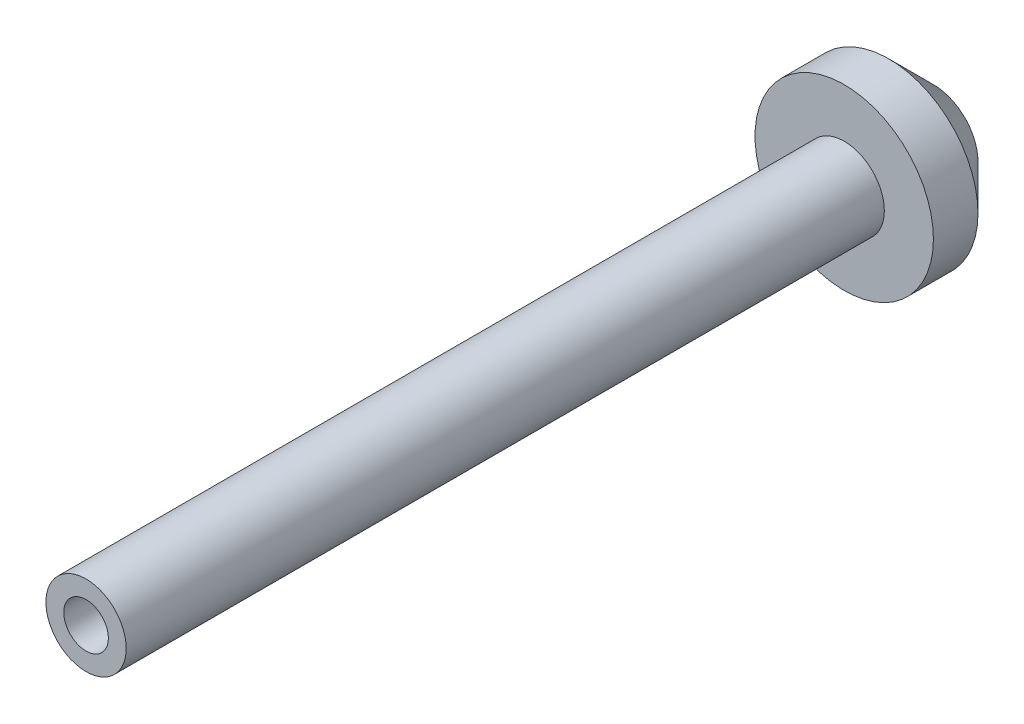
ISO-10303-21;
HEADER;
FILE_DESCRIPTION(('STEP AP214'),'2;1');
FILE_NAME('part.step','',(''),(''),'','','');
FILE_SCHEMA(('AUTOMOTIVE_DESIGN { 1 0 10303 214 1 1 1 1 }'));
ENDSEC;
DATA;
#1=APPLICATION_CONTEXT('core data for automotive mechanical design processes');
#2=APPLICATION_PROTOCOL_DEFINITION('international standard','automotive_design',2000,#1);
#3=PRODUCT_CONTEXT('',#1,'mechanical');
#4=PRODUCT('Part','Part','',(#3));
#5=PRODUCT_RELATED_PRODUCT_CATEGORY('part','',(#4));
#6=PRODUCT_DEFINITION_FORMATION('','',#4);
#7=PRODUCT_DEFINITION_CONTEXT('part definition',#1,'design');
#8=PRODUCT_DEFINITION('design','',#6,#7);
#9=PRODUCT_DEFINITION_SHAPE('','',#8);
#10=(LENGTH_UNIT() NAMED_UNIT(*) SI_UNIT(.MILLI.,.METRE.));
#11=(NAMED_UNIT(*) PLANE_ANGLE_UNIT() SI_UNIT($,.RADIAN.));
#12=(NAMED_UNIT(*) SI_UNIT($,.STERADIAN.) SOLID_ANGLE_UNIT());
#13=UNCERTAINTY_MEASURE_WITH_UNIT(LENGTH_MEASURE(1.E-05),#10,'distance_accuracy_value','');
#14=(GEOMETRIC_REPRESENTATION_CONTEXT(3) GLOBAL_UNCERTAINTY_ASSIGNED_CONTEXT((#13)) GLOBAL_UNIT_ASSIGNED_CONTEXT((#10,
#11,#12)) REPRESENTATION_CONTEXT('',''));
#15=CARTESIAN_POINT('',(0.,0.,0.));
#16=DIRECTION('',(0.,0.,1.));
#17=DIRECTION('',(1.,0.,0.));
#18=AXIS2_PLACEMENT_3D('',#15,#16,#17);
#19=CARTESIAN_POINT('',(0.,0.,5.));
#20=DIRECTION('',(0.,0.,-1.));
#21=DIRECTION('',(-1.,0.,0.));
#22=AXIS2_PLACEMENT_3D('',#19,#20,#21);
#23=CYLINDRICAL_SURFACE('',#22,5.);
#24=CARTESIAN_POINT('',(0.,0.,2.49999999999999));
#25=DIRECTION('',(0.,0.,1.));
#26=DIRECTION('',(1.,0.,0.));
#27=AXIS2_PLACEMENT_3D('',#24,#25,#26);
#28=CIRCLE('',#27,5.);
#29=CARTESIAN_POINT('',(5.,0.,2.49999999999999));
#30=VERTEX_POINT('',#29);
#31=EDGE_CURVE('E40',#30,#30,#28,.T.);
#32=ORIENTED_EDGE('',*,*,#31,.T.);
#33=EDGE_LOOP('',(#32));
#34=FACE_BOUND('',#33,.T.);
#35=CARTESIAN_POINT('',(0.,0.,5.));
#36=DIRECTION('',(0.,0.,1.));
#37=DIRECTION('',(1.,0.,0.));
#38=AXIS2_PLACEMENT_3D('',#35,#36,#37);
#39=CIRCLE('',#38,5.);
#40=CARTESIAN_POINT('',(5.,0.,5.));
#41=VERTEX_POINT('',#40);
#42=EDGE_CURVE('E48',#41,#41,#39,.T.);
#43=ORIENTED_EDGE('',*,*,#42,.F.);
#44=EDGE_LOOP('',(#43));
#45=FACE_BOUND('',#44,.T.);
#46=ADVANCED_FACE('F32',(#34,#45),#23,.T.);
#47=CARTESIAN_POINT('',(0.,0.,5.));
#48=DIRECTION('',(0.,0.,1.));
#49=DIRECTION('',(1.,0.,0.));
#50=AXIS2_PLACEMENT_3D('',#47,#48,#49);
#51=PLANE('',#50);
#52=CARTESIAN_POINT('',(0.,0.,5.));
#53=DIRECTION('',(0.,0.,1.));
#54=DIRECTION('',(1.,0.,0.));
#55=AXIS2_PLACEMENT_3D('',#52,#53,#54);
#56=CIRCLE('',#55,2.25);
#57=CARTESIAN_POINT('',(2.25,0.,5.));
#58=VERTEX_POINT('',#57);
#59=EDGE_CURVE('E44',#58,#58,#56,.T.);
#60=ORIENTED_EDGE('',*,*,#59,.F.);
#61=EDGE_LOOP('',(#60));
#62=FACE_BOUND('',#61,.T.);
#63=ORIENTED_EDGE('',*,*,#42,.T.);
#64=EDGE_LOOP('',(#63));
#65=FACE_BOUND('',#64,.T.);
#66=ADVANCED_FACE('F84',(#62,#65),#51,.T.);
#67=CARTESIAN_POINT('',(0.,0.,0.));
#68=DIRECTION('',(0.,0.,1.));
#69=DIRECTION('',(1.,0.,0.));
#70=AXIS2_PLACEMENT_3D('',#67,#68,#69);
#71=PLANE('',#70);
#72=CARTESIAN_POINT('',(0.,0.,0.));
#73=DIRECTION('',(0.,0.,1.));
#74=DIRECTION('',(1.,0.,0.));
#75=AXIS2_PLACEMENT_3D('',#72,#73,#74);
#76=CIRCLE('',#75,2.5);
#77=CARTESIAN_POINT('',(2.5,0.,0.));
#78=VERTEX_POINT('',#77);
#79=EDGE_CURVE('E10',#78,#78,#76,.F.);
#80=ORIENTED_EDGE('',*,*,#79,.T.);
#81=EDGE_LOOP('',(#80));
#82=FACE_BOUND('',#81,.T.);
#83=ADVANCED_FACE('F80',(#82),#71,.F.);
#84=CARTESIAN_POINT('',(0.,0.,47.5));
#85=DIRECTION('',(0.,0.,-1.));
#86=DIRECTION('',(-1.,0.,0.));
#87=AXIS2_PLACEMENT_3D('',#84,#85,#86);
#88=CYLINDRICAL_SURFACE('',#87,2.25);
#89=CARTESIAN_POINT('',(0.,0.,47.5));
#90=DIRECTION('',(0.,0.,1.));
#91=DIRECTION('',(1.,0.,0.));
#92=AXIS2_PLACEMENT_3D('',#89,#90,#91);
#93=CIRCLE('',#92,2.25);
#94=CARTESIAN_POINT('',(2.25,0.,47.5));
#95=VERTEX_POINT('',#94);
#96=EDGE_CURVE('E52',#95,#95,#93,.T.);
#97=ORIENTED_EDGE('',*,*,#96,.F.);
#98=EDGE_LOOP('',(#97));
#99=FACE_BOUND('',#98,.T.);
#100=ORIENTED_EDGE('',*,*,#59,.T.);
#101=EDGE_LOOP('',(#100));
#102=FACE_BOUND('',#101,.T.);
#103=ADVANCED_FACE('F74',(#99,#102),#88,.T.);
#104=CARTESIAN_POINT('',(0.,0.,47.5));
#105=DIRECTION('',(0.,0.,1.));
#106=DIRECTION('',(1.,0.,0.));
#107=AXIS2_PLACEMENT_3D('',#104,#105,#106);
#108=PLANE('',#107);
#109=CARTESIAN_POINT('',(0.,0.,47.5));
#110=DIRECTION('',(0.,0.,1.));
#111=DIRECTION('',(1.,0.,0.));
#112=AXIS2_PLACEMENT_3D('',#109,#110,#111);
#113=CIRCLE('',#112,1.25);
#114=CARTESIAN_POINT('',(1.25,0.,47.5));
#115=VERTEX_POINT('',#114);
#116=EDGE_CURVE('E57',#115,#115,#113,.T.);
#117=ORIENTED_EDGE('',*,*,#116,.F.);
#118=EDGE_LOOP('',(#117));
#119=FACE_BOUND('',#118,.T.);
#120=ORIENTED_EDGE('',*,*,#96,.T.);
#121=EDGE_LOOP('',(#120));
#122=FACE_BOUND('',#121,.T.);
#123=ADVANCED_FACE('F68',(#119,#122),#108,.T.);
#124=CARTESIAN_POINT('',(0.,0.,37.5));
#125=DIRECTION('',(0.,0.,1.));
#126=DIRECTION('',(1.,0.,0.));
#127=AXIS2_PLACEMENT_3D('',#124,#125,#126);
#128=CYLINDRICAL_SURFACE('',#127,1.25);
#129=CARTESIAN_POINT('',(0.,0.,37.5));
#130=DIRECTION('',(0.,0.,1.));
#131=DIRECTION('',(1.,0.,0.));
#132=AXIS2_PLACEMENT_3D('',#129,#130,#131);
#133=CIRCLE('',#132,1.25);
#134=CARTESIAN_POINT('',(1.25,0.,37.5));
#135=VERTEX_POINT('',#134);
#136=EDGE_CURVE('E56',#135,#135,#133,.T.);
#137=ORIENTED_EDGE('',*,*,#136,.F.);
#138=EDGE_LOOP('',(#137));
#139=FACE_BOUND('',#138,.T.);
#140=ORIENTED_EDGE('',*,*,#116,.T.);
#141=EDGE_LOOP('',(#140));
#142=FACE_BOUND('',#141,.T.);
#143=ADVANCED_FACE('F65',(#139,#142),#128,.F.);
#144=CARTESIAN_POINT('',(0.,0.,37.5));
#145=DIRECTION('',(0.,0.,1.));
#146=DIRECTION('',(1.,0.,0.));
#147=AXIS2_PLACEMENT_3D('',#144,#145,#146);
#148=PLANE('',#147);
#149=ORIENTED_EDGE('',*,*,#136,.T.);
#150=EDGE_LOOP('',(#149));
#151=FACE_BOUND('',#150,.T.);
#152=ADVANCED_FACE('F63',(#151),#148,.T.);
#153=CARTESIAN_POINT('',(0.,0.,2.49999999999999));
#154=DIRECTION('',(0.,0.,1.));
#155=DIRECTION('',(1.,0.,0.));
#156=AXIS2_PLACEMENT_3D('',#153,#154,#155);
#157=CONICAL_SURFACE('',#156,5.,0.78539816339745);
#158=ORIENTED_EDGE('',*,*,#79,.F.);
#159=EDGE_LOOP('',(#158));
#160=FACE_BOUND('',#159,.T.);
#161=ORIENTED_EDGE('',*,*,#31,.F.);
#162=EDGE_LOOP('',(#161));
#163=FACE_BOUND('',#162,.T.);
#164=ADVANCED_FACE('F35',(#160,#163),#157,.T.);
#165=CLOSED_SHELL('',(#46,#66,#83,#103,#123,#143,#152,#164));
#166=MANIFOLD_SOLID_BREP('B2',#165);
#167=ADVANCED_BREP_SHAPE_REPRESENTATION('',(#18,#166),#14);
#168=SHAPE_DEFINITION_REPRESENTATION(#9,#167);
ENDSEC;
END-ISO-10303-21;
